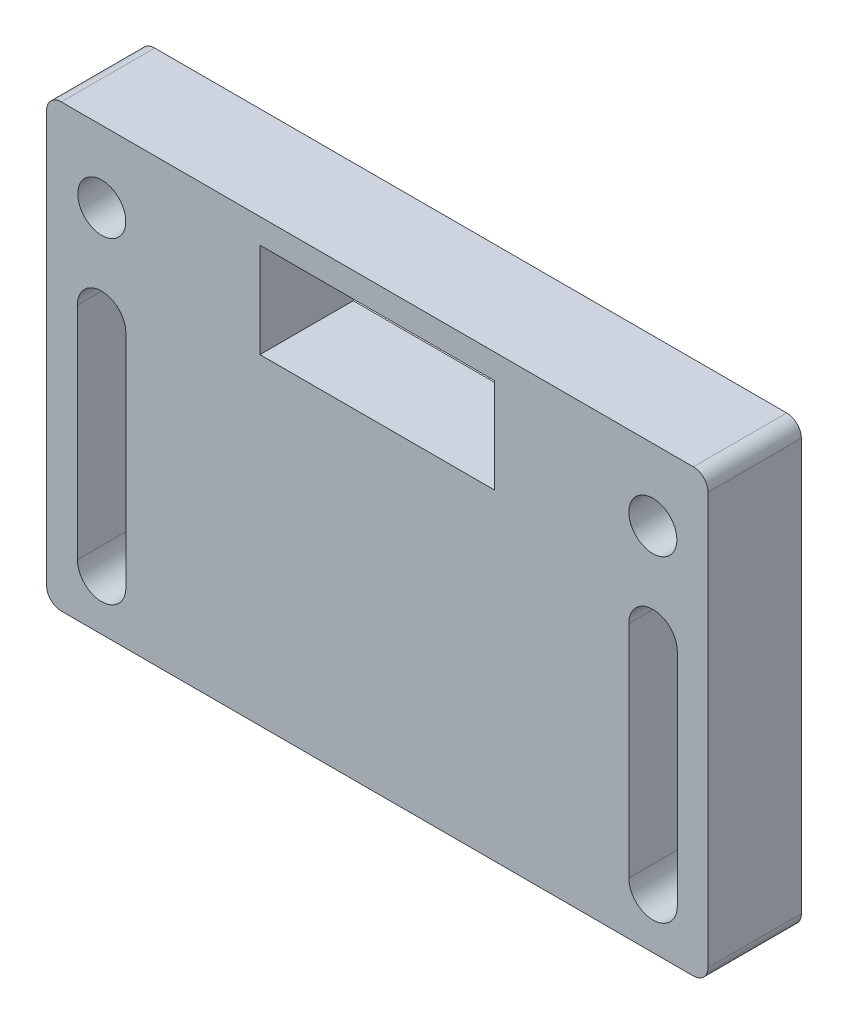
ISO-10303-21;
HEADER;
FILE_DESCRIPTION(('STEP AP214'),'2;1');
FILE_NAME('part.step','',(''),(''),'','','');
FILE_SCHEMA(('AUTOMOTIVE_DESIGN { 1 0 10303 214 1 1 1 1 }'));
ENDSEC;
DATA;
#1=APPLICATION_CONTEXT('core data for automotive mechanical design processes');
#2=APPLICATION_PROTOCOL_DEFINITION('international standard','automotive_design',2000,#1);
#3=PRODUCT_CONTEXT('',#1,'mechanical');
#4=PRODUCT('Part','Part','',(#3));
#5=PRODUCT_RELATED_PRODUCT_CATEGORY('part','',(#4));
#6=PRODUCT_DEFINITION_FORMATION('','',#4);
#7=PRODUCT_DEFINITION_CONTEXT('part definition',#1,'design');
#8=PRODUCT_DEFINITION('design','',#6,#7);
#9=PRODUCT_DEFINITION_SHAPE('','',#8);
#10=(LENGTH_UNIT() NAMED_UNIT(*) SI_UNIT(.MILLI.,.METRE.));
#11=(NAMED_UNIT(*) PLANE_ANGLE_UNIT() SI_UNIT($,.RADIAN.));
#12=(NAMED_UNIT(*) SI_UNIT($,.STERADIAN.) SOLID_ANGLE_UNIT());
#13=UNCERTAINTY_MEASURE_WITH_UNIT(LENGTH_MEASURE(1.E-05),#10,'distance_accuracy_value','');
#14=(GEOMETRIC_REPRESENTATION_CONTEXT(3) GLOBAL_UNCERTAINTY_ASSIGNED_CONTEXT((#13)) GLOBAL_UNIT_ASSIGNED_CONTEXT((#10,
#11,#12)) REPRESENTATION_CONTEXT('',''));
#15=CARTESIAN_POINT('',(0.,0.,0.));
#16=DIRECTION('',(0.,0.,1.));
#17=DIRECTION('',(1.,0.,0.));
#18=AXIS2_PLACEMENT_3D('',#15,#16,#17);
#19=CARTESIAN_POINT('',(0.,0.,0.));
#20=DIRECTION('',(0.,0.,1.));
#21=DIRECTION('',(1.,0.,0.));
#22=AXIS2_PLACEMENT_3D('',#19,#20,#21);
#23=PLANE('',#22);
#24=DIRECTION('',(0.,-1.,0.));
#25=VECTOR('',#24,1.);
#26=CARTESIAN_POINT('',(10.785,-22.8473649807679,0.));
#27=LINE('',#26,#25);
#28=CARTESIAN_POINT('',(10.785,-22.8473649807679,0.));
#29=VERTEX_POINT('',#28);
#30=CARTESIAN_POINT('',(10.785,-52.8473649807679,0.));
#31=VERTEX_POINT('',#30);
#32=EDGE_CURVE('E202',#29,#31,#27,.T.);
#33=ORIENTED_EDGE('',*,*,#32,.F.);
#34=CARTESIAN_POINT('',(7.485,-22.8473649807679,0.));
#35=DIRECTION('',(0.,0.,-1.));
#36=DIRECTION('',(-1.,0.,0.));
#37=AXIS2_PLACEMENT_3D('',#34,#35,#36);
#38=CIRCLE('',#37,3.3);
#39=CARTESIAN_POINT('',(4.185,-22.8473649807679,0.));
#40=VERTEX_POINT('',#39);
#41=EDGE_CURVE('E51',#40,#29,#38,.T.);
#42=ORIENTED_EDGE('',*,*,#41,.F.);
#43=DIRECTION('',(0.,1.,0.));
#44=VECTOR('',#43,1.);
#45=CARTESIAN_POINT('',(4.185,-52.8473649807679,0.));
#46=LINE('',#45,#44);
#47=CARTESIAN_POINT('',(4.185,-52.8473649807679,0.));
#48=VERTEX_POINT('',#47);
#49=EDGE_CURVE('E193',#48,#40,#46,.T.);
#50=ORIENTED_EDGE('',*,*,#49,.F.);
#51=CARTESIAN_POINT('',(7.485,-52.8473649807679,0.));
#52=DIRECTION('',(0.,0.,-1.));
#53=DIRECTION('',(-1.,0.,0.));
#54=AXIS2_PLACEMENT_3D('',#51,#52,#53);
#55=CIRCLE('',#54,3.3);
#56=EDGE_CURVE('E196',#31,#48,#55,.T.);
#57=ORIENTED_EDGE('',*,*,#56,.F.);
#58=EDGE_LOOP('',(#33,#42,#50,#57));
#59=FACE_BOUND('',#58,.T.);
#60=DIRECTION('',(0.,1.,0.));
#61=VECTOR('',#60,1.);
#62=CARTESIAN_POINT('',(79.215,-52.8473649807679,0.));
#63=LINE('',#62,#61);
#64=CARTESIAN_POINT('',(79.215,-52.8473649807679,0.));
#65=VERTEX_POINT('',#64);
#66=CARTESIAN_POINT('',(79.215,-22.8473649807679,0.));
#67=VERTEX_POINT('',#66);
#68=EDGE_CURVE('E228',#65,#67,#63,.T.);
#69=ORIENTED_EDGE('',*,*,#68,.F.);
#70=CARTESIAN_POINT('',(82.515,-52.8473649807679,0.));
#71=DIRECTION('',(0.,0.,-1.));
#72=DIRECTION('',(-1.,0.,0.));
#73=AXIS2_PLACEMENT_3D('',#70,#71,#72);
#74=CIRCLE('',#73,3.3);
#75=CARTESIAN_POINT('',(85.815,-52.8473649807679,0.));
#76=VERTEX_POINT('',#75);
#77=EDGE_CURVE('E59',#76,#65,#74,.T.);
#78=ORIENTED_EDGE('',*,*,#77,.F.);
#79=DIRECTION('',(0.,-1.,0.));
#80=VECTOR('',#79,1.);
#81=CARTESIAN_POINT('',(85.815,-52.8473649807679,0.));
#82=LINE('',#81,#80);
#83=CARTESIAN_POINT('',(85.815,-22.8473649807679,0.));
#84=VERTEX_POINT('',#83);
#85=EDGE_CURVE('E217',#84,#76,#82,.T.);
#86=ORIENTED_EDGE('',*,*,#85,.F.);
#87=CARTESIAN_POINT('',(82.515,-22.8473649807679,0.));
#88=DIRECTION('',(0.,0.,-1.));
#89=DIRECTION('',(-1.,0.,0.));
#90=AXIS2_PLACEMENT_3D('',#87,#88,#89);
#91=CIRCLE('',#90,3.3);
#92=EDGE_CURVE('E231',#67,#84,#91,.T.);
#93=ORIENTED_EDGE('',*,*,#92,.F.);
#94=EDGE_LOOP('',(#69,#78,#86,#93));
#95=FACE_BOUND('',#94,.T.);
#96=CARTESIAN_POINT('',(82.49,-9.71709190426984,0.));
#97=DIRECTION('',(0.,0.,-1.));
#98=DIRECTION('',(-1.,0.,0.));
#99=AXIS2_PLACEMENT_3D('',#96,#97,#98);
#100=CIRCLE('',#99,6.4389);
#101=CARTESIAN_POINT('',(76.0511,-9.71709190426984,0.));
#102=VERTEX_POINT('',#101);
#103=EDGE_CURVE('E209',#102,#102,#100,.T.);
#104=ORIENTED_EDGE('',*,*,#103,.F.);
#105=EDGE_LOOP('',(#104));
#106=FACE_BOUND('',#105,.T.);
#107=DIRECTION('',(1.,0.,0.));
#108=VECTOR('',#107,1.);
#109=CARTESIAN_POINT('',(0.,-60.,0.));
#110=LINE('',#109,#108);
#111=CARTESIAN_POINT('',(2.00000000000001,-60.,0.));
#112=VERTEX_POINT('',#111);
#113=CARTESIAN_POINT('',(88.,-60.,0.));
#114=VERTEX_POINT('',#113);
#115=EDGE_CURVE('E305',#112,#114,#110,.T.);
#116=ORIENTED_EDGE('',*,*,#115,.F.);
#117=CARTESIAN_POINT('',(2.00000000000001,-58.,0.));
#118=DIRECTION('',(0.,0.,1.));
#119=DIRECTION('',(1.,0.,0.));
#120=AXIS2_PLACEMENT_3D('',#117,#118,#119);
#121=CIRCLE('',#120,2.);
#122=CARTESIAN_POINT('',(0.,-58.,0.));
#123=VERTEX_POINT('',#122);
#124=EDGE_CURVE('E323',#112,#123,#121,.F.);
#125=ORIENTED_EDGE('',*,*,#124,.T.);
#126=DIRECTION('',(0.,-1.,0.));
#127=VECTOR('',#126,1.);
#128=CARTESIAN_POINT('',(0.,0.,0.));
#129=LINE('',#128,#127);
#130=CARTESIAN_POINT('',(0.,-2.,0.));
#131=VERTEX_POINT('',#130);
#132=EDGE_CURVE('E288',#131,#123,#129,.T.);
#133=ORIENTED_EDGE('',*,*,#132,.F.);
#134=CARTESIAN_POINT('',(2.,-2.,0.));
#135=DIRECTION('',(0.,0.,1.));
#136=DIRECTION('',(1.,0.,0.));
#137=AXIS2_PLACEMENT_3D('',#134,#135,#136);
#138=CIRCLE('',#137,2.);
#139=CARTESIAN_POINT('',(2.,0.,0.));
#140=VERTEX_POINT('',#139);
#141=EDGE_CURVE('E321',#131,#140,#138,.F.);
#142=ORIENTED_EDGE('',*,*,#141,.T.);
#143=DIRECTION('',(-1.,0.,0.));
#144=VECTOR('',#143,1.);
#145=CARTESIAN_POINT('',(0.,0.,0.));
#146=LINE('',#145,#144);
#147=CARTESIAN_POINT('',(88.,0.,0.));
#148=VERTEX_POINT('',#147);
#149=EDGE_CURVE('E293',#148,#140,#146,.T.);
#150=ORIENTED_EDGE('',*,*,#149,.F.);
#151=CARTESIAN_POINT('',(88.,-2.,0.));
#152=DIRECTION('',(0.,0.,1.));
#153=DIRECTION('',(1.,0.,0.));
#154=AXIS2_PLACEMENT_3D('',#151,#152,#153);
#155=CIRCLE('',#154,2.);
#156=CARTESIAN_POINT('',(90.,-2.,0.));
#157=VERTEX_POINT('',#156);
#158=EDGE_CURVE('E319',#148,#157,#155,.F.);
#159=ORIENTED_EDGE('',*,*,#158,.T.);
#160=DIRECTION('',(0.,1.,0.));
#161=VECTOR('',#160,1.);
#162=CARTESIAN_POINT('',(90.,0.,0.));
#163=LINE('',#162,#161);
#164=CARTESIAN_POINT('',(90.,-58.,0.));
#165=VERTEX_POINT('',#164);
#166=EDGE_CURVE('E308',#165,#157,#163,.T.);
#167=ORIENTED_EDGE('',*,*,#166,.F.);
#168=CARTESIAN_POINT('',(88.,-58.,0.));
#169=DIRECTION('',(0.,0.,1.));
#170=DIRECTION('',(1.,0.,0.));
#171=AXIS2_PLACEMENT_3D('',#168,#169,#170);
#172=CIRCLE('',#171,2.);
#173=EDGE_CURVE('E317',#165,#114,#172,.F.);
#174=ORIENTED_EDGE('',*,*,#173,.T.);
#175=EDGE_LOOP('',(#116,#125,#133,#142,#150,#159,#167,#174));
#176=FACE_BOUND('',#175,.T.);
#177=DIRECTION('',(0.,-1.,0.));
#178=VECTOR('',#177,1.);
#179=CARTESIAN_POINT('',(29.025,-3.36709190426983,0.));
#180=LINE('',#179,#178);
#181=CARTESIAN_POINT('',(29.025,-3.36709190426983,0.));
#182=VERTEX_POINT('',#181);
#183=CARTESIAN_POINT('',(29.025,-16.2670919042698,0.));
#184=VERTEX_POINT('',#183);
#185=EDGE_CURVE('E259',#182,#184,#180,.T.);
#186=ORIENTED_EDGE('',*,*,#185,.T.);
#187=DIRECTION('',(1.,0.,0.));
#188=VECTOR('',#187,1.);
#189=CARTESIAN_POINT('',(29.025,-16.2670919042698,0.));
#190=LINE('',#189,#188);
#191=CARTESIAN_POINT('',(60.975,-16.2670919042698,0.));
#192=VERTEX_POINT('',#191);
#193=EDGE_CURVE('E273',#184,#192,#190,.T.);
#194=ORIENTED_EDGE('',*,*,#193,.T.);
#195=DIRECTION('',(0.,1.,0.));
#196=VECTOR('',#195,1.);
#197=CARTESIAN_POINT('',(60.975,-16.2670919042698,0.));
#198=LINE('',#197,#196);
#199=CARTESIAN_POINT('',(60.975,-3.36709190426982,0.));
#200=VERTEX_POINT('',#199);
#201=EDGE_CURVE('E276',#192,#200,#198,.T.);
#202=ORIENTED_EDGE('',*,*,#201,.T.);
#203=DIRECTION('',(-1.,0.,0.));
#204=VECTOR('',#203,1.);
#205=CARTESIAN_POINT('',(60.975,-3.36709190426982,0.));
#206=LINE('',#205,#204);
#207=EDGE_CURVE('E263',#200,#182,#206,.T.);
#208=ORIENTED_EDGE('',*,*,#207,.T.);
#209=EDGE_LOOP('',(#186,#194,#202,#208));
#210=FACE_BOUND('',#209,.T.);
#211=CARTESIAN_POINT('',(7.51,-9.71709190426983,0.));
#212=DIRECTION('',(0.,0.,-1.));
#213=DIRECTION('',(-1.,0.,0.));
#214=AXIS2_PLACEMENT_3D('',#211,#212,#213);
#215=CIRCLE('',#214,6.4389);
#216=CARTESIAN_POINT('',(1.0711,-9.71709190426983,0.));
#217=VERTEX_POINT('',#216);
#218=EDGE_CURVE('E250',#217,#217,#215,.T.);
#219=ORIENTED_EDGE('',*,*,#218,.F.);
#220=EDGE_LOOP('',(#219));
#221=FACE_BOUND('',#220,.T.);
#222=ADVANCED_FACE('F36',(#59,#95,#106,#176,#210,#221),#23,.F.);
#223=CARTESIAN_POINT('',(0.,0.,12.7));
#224=DIRECTION('',(0.,0.,1.));
#225=DIRECTION('',(1.,0.,0.));
#226=AXIS2_PLACEMENT_3D('',#223,#224,#225);
#227=PLANE('',#226);
#228=CARTESIAN_POINT('',(7.485,-22.8473649807679,12.7));
#229=DIRECTION('',(0.,0.,-1.));
#230=DIRECTION('',(-1.,0.,0.));
#231=AXIS2_PLACEMENT_3D('',#228,#229,#230);
#232=CIRCLE('',#231,3.3);
#233=CARTESIAN_POINT('',(4.185,-22.8473649807679,12.7));
#234=VERTEX_POINT('',#233);
#235=CARTESIAN_POINT('',(10.785,-22.8473649807679,12.7));
#236=VERTEX_POINT('',#235);
#237=EDGE_CURVE('E174',#234,#236,#232,.T.);
#238=ORIENTED_EDGE('',*,*,#237,.T.);
#239=DIRECTION('',(0.,-1.,0.));
#240=VECTOR('',#239,1.);
#241=CARTESIAN_POINT('',(10.785,-22.8473649807679,12.7));
#242=LINE('',#241,#240);
#243=CARTESIAN_POINT('',(10.785,-52.8473649807679,12.7));
#244=VERTEX_POINT('',#243);
#245=EDGE_CURVE('E184',#236,#244,#242,.T.);
#246=ORIENTED_EDGE('',*,*,#245,.T.);
#247=CARTESIAN_POINT('',(7.485,-52.8473649807679,12.7));
#248=DIRECTION('',(0.,0.,-1.));
#249=DIRECTION('',(-1.,0.,0.));
#250=AXIS2_PLACEMENT_3D('',#247,#248,#249);
#251=CIRCLE('',#250,3.3);
#252=CARTESIAN_POINT('',(4.185,-52.8473649807679,12.7));
#253=VERTEX_POINT('',#252);
#254=EDGE_CURVE('E188',#244,#253,#251,.T.);
#255=ORIENTED_EDGE('',*,*,#254,.T.);
#256=DIRECTION('',(0.,1.,0.));
#257=VECTOR('',#256,1.);
#258=CARTESIAN_POINT('',(4.185,-52.8473649807679,12.7));
#259=LINE('',#258,#257);
#260=EDGE_CURVE('E180',#253,#234,#259,.T.);
#261=ORIENTED_EDGE('',*,*,#260,.T.);
#262=EDGE_LOOP('',(#238,#246,#255,#261));
#263=FACE_BOUND('',#262,.T.);
#264=CARTESIAN_POINT('',(82.515,-52.8473649807679,12.7));
#265=DIRECTION('',(0.,0.,-1.));
#266=DIRECTION('',(-1.,0.,0.));
#267=AXIS2_PLACEMENT_3D('',#264,#265,#266);
#268=CIRCLE('',#267,3.3);
#269=CARTESIAN_POINT('',(85.815,-52.8473649807679,12.7));
#270=VERTEX_POINT('',#269);
#271=CARTESIAN_POINT('',(79.215,-52.8473649807679,12.7));
#272=VERTEX_POINT('',#271);
#273=EDGE_CURVE('E213',#270,#272,#268,.T.);
#274=ORIENTED_EDGE('',*,*,#273,.T.);
#275=DIRECTION('',(0.,1.,0.));
#276=VECTOR('',#275,1.);
#277=CARTESIAN_POINT('',(79.215,-52.8473649807679,12.7));
#278=LINE('',#277,#276);
#279=CARTESIAN_POINT('',(79.215,-22.8473649807679,12.7));
#280=VERTEX_POINT('',#279);
#281=EDGE_CURVE('E216',#272,#280,#278,.T.);
#282=ORIENTED_EDGE('',*,*,#281,.T.);
#283=CARTESIAN_POINT('',(82.515,-22.8473649807679,12.7));
#284=DIRECTION('',(0.,0.,-1.));
#285=DIRECTION('',(-1.,0.,0.));
#286=AXIS2_PLACEMENT_3D('',#283,#284,#285);
#287=CIRCLE('',#286,3.3);
#288=CARTESIAN_POINT('',(85.815,-22.8473649807679,12.7));
#289=VERTEX_POINT('',#288);
#290=EDGE_CURVE('E220',#280,#289,#287,.T.);
#291=ORIENTED_EDGE('',*,*,#290,.T.);
#292=DIRECTION('',(0.,-1.,0.));
#293=VECTOR('',#292,1.);
#294=CARTESIAN_POINT('',(85.815,-52.8473649807679,12.7));
#295=LINE('',#294,#293);
#296=EDGE_CURVE('E223',#289,#270,#295,.T.);
#297=ORIENTED_EDGE('',*,*,#296,.T.);
#298=EDGE_LOOP('',(#274,#282,#291,#297));
#299=FACE_BOUND('',#298,.T.);
#300=CARTESIAN_POINT('',(82.49,-9.71709190426984,12.7));
#301=DIRECTION('',(0.,0.,-1.));
#302=DIRECTION('',(-1.,0.,0.));
#303=AXIS2_PLACEMENT_3D('',#300,#301,#302);
#304=CIRCLE('',#303,3.26389999999999);
#305=CARTESIAN_POINT('',(79.2261,-9.71709190426984,12.7));
#306=VERTEX_POINT('',#305);
#307=EDGE_CURVE('E247',#306,#306,#304,.T.);
#308=ORIENTED_EDGE('',*,*,#307,.T.);
#309=EDGE_LOOP('',(#308));
#310=FACE_BOUND('',#309,.T.);
#311=CARTESIAN_POINT('',(7.51,-9.71709190426983,12.7));
#312=DIRECTION('',(0.,0.,-1.));
#313=DIRECTION('',(-1.,0.,0.));
#314=AXIS2_PLACEMENT_3D('',#311,#312,#313);
#315=CIRCLE('',#314,3.26389999999999);
#316=CARTESIAN_POINT('',(4.24610000000001,-9.71709190426983,12.7));
#317=VERTEX_POINT('',#316);
#318=EDGE_CURVE('E256',#317,#317,#315,.T.);
#319=ORIENTED_EDGE('',*,*,#318,.T.);
#320=EDGE_LOOP('',(#319));
#321=FACE_BOUND('',#320,.T.);
#322=DIRECTION('',(0.,-1.,0.));
#323=VECTOR('',#322,1.);
#324=CARTESIAN_POINT('',(0.,0.,12.7));
#325=LINE('',#324,#323);
#326=CARTESIAN_POINT('',(0.,-2.,12.7));
#327=VERTEX_POINT('',#326);
#328=CARTESIAN_POINT('',(0.,-58.,12.7));
#329=VERTEX_POINT('',#328);
#330=EDGE_CURVE('E289',#327,#329,#325,.T.);
#331=ORIENTED_EDGE('',*,*,#330,.T.);
#332=CARTESIAN_POINT('',(2.00000000000001,-58.,12.7));
#333=DIRECTION('',(0.,0.,1.));
#334=DIRECTION('',(1.,0.,0.));
#335=AXIS2_PLACEMENT_3D('',#332,#333,#334);
#336=CIRCLE('',#335,2.);
#337=CARTESIAN_POINT('',(2.00000000000001,-60.,12.7));
#338=VERTEX_POINT('',#337);
#339=EDGE_CURVE('E336',#329,#338,#336,.T.);
#340=ORIENTED_EDGE('',*,*,#339,.T.);
#341=DIRECTION('',(1.,0.,0.));
#342=VECTOR('',#341,1.);
#343=CARTESIAN_POINT('',(0.,-60.,12.7));
#344=LINE('',#343,#342);
#345=CARTESIAN_POINT('',(88.,-60.,12.7));
#346=VERTEX_POINT('',#345);
#347=EDGE_CURVE('E292',#338,#346,#344,.T.);
#348=ORIENTED_EDGE('',*,*,#347,.T.);
#349=CARTESIAN_POINT('',(88.,-58.,12.7));
#350=DIRECTION('',(0.,0.,1.));
#351=DIRECTION('',(1.,0.,0.));
#352=AXIS2_PLACEMENT_3D('',#349,#350,#351);
#353=CIRCLE('',#352,2.);
#354=CARTESIAN_POINT('',(90.,-58.,12.7));
#355=VERTEX_POINT('',#354);
#356=EDGE_CURVE('E330',#346,#355,#353,.T.);
#357=ORIENTED_EDGE('',*,*,#356,.T.);
#358=DIRECTION('',(0.,1.,0.));
#359=VECTOR('',#358,1.);
#360=CARTESIAN_POINT('',(90.,0.,12.7));
#361=LINE('',#360,#359);
#362=CARTESIAN_POINT('',(90.,-2.,12.7));
#363=VERTEX_POINT('',#362);
#364=EDGE_CURVE('E296',#355,#363,#361,.T.);
#365=ORIENTED_EDGE('',*,*,#364,.T.);
#366=CARTESIAN_POINT('',(88.,-2.,12.7));
#367=DIRECTION('',(0.,0.,1.));
#368=DIRECTION('',(1.,0.,0.));
#369=AXIS2_PLACEMENT_3D('',#366,#367,#368);
#370=CIRCLE('',#369,2.);
#371=CARTESIAN_POINT('',(88.,0.,12.7));
#372=VERTEX_POINT('',#371);
#373=EDGE_CURVE('E332',#363,#372,#370,.T.);
#374=ORIENTED_EDGE('',*,*,#373,.T.);
#375=DIRECTION('',(-1.,0.,0.));
#376=VECTOR('',#375,1.);
#377=CARTESIAN_POINT('',(0.,0.,12.7));
#378=LINE('',#377,#376);
#379=CARTESIAN_POINT('',(2.,0.,12.7));
#380=VERTEX_POINT('',#379);
#381=EDGE_CURVE('E299',#372,#380,#378,.T.);
#382=ORIENTED_EDGE('',*,*,#381,.T.);
#383=CARTESIAN_POINT('',(2.,-2.,12.7));
#384=DIRECTION('',(0.,0.,1.));
#385=DIRECTION('',(1.,0.,0.));
#386=AXIS2_PLACEMENT_3D('',#383,#384,#385);
#387=CIRCLE('',#386,2.);
#388=EDGE_CURVE('E334',#380,#327,#387,.T.);
#389=ORIENTED_EDGE('',*,*,#388,.T.);
#390=EDGE_LOOP('',(#331,#340,#348,#357,#365,#374,#382,#389));
#391=FACE_BOUND('',#390,.T.);
#392=DIRECTION('',(1.,0.,0.));
#393=VECTOR('',#392,1.);
#394=CARTESIAN_POINT('',(29.025,-16.2670919042698,12.7));
#395=LINE('',#394,#393);
#396=CARTESIAN_POINT('',(29.025,-16.2670919042698,12.7));
#397=VERTEX_POINT('',#396);
#398=CARTESIAN_POINT('',(60.975,-16.2670919042698,12.7));
#399=VERTEX_POINT('',#398);
#400=EDGE_CURVE('E265',#397,#399,#395,.T.);
#401=ORIENTED_EDGE('',*,*,#400,.F.);
#402=DIRECTION('',(0.,-1.,0.));
#403=VECTOR('',#402,1.);
#404=CARTESIAN_POINT('',(29.025,-3.36709190426983,12.7));
#405=LINE('',#404,#403);
#406=CARTESIAN_POINT('',(29.025,-3.36709190426983,12.7));
#407=VERTEX_POINT('',#406);
#408=EDGE_CURVE('E262',#407,#397,#405,.T.);
#409=ORIENTED_EDGE('',*,*,#408,.F.);
#410=DIRECTION('',(-1.,0.,0.));
#411=VECTOR('',#410,1.);
#412=CARTESIAN_POINT('',(45.,-3.36709190426982,12.7));
#413=LINE('',#412,#411);
#414=CARTESIAN_POINT('',(60.975,-3.36709190426982,12.7));
#415=VERTEX_POINT('',#414);
#416=EDGE_CURVE('E260',#415,#407,#413,.T.);
#417=ORIENTED_EDGE('',*,*,#416,.F.);
#418=DIRECTION('',(0.,1.,0.));
#419=VECTOR('',#418,1.);
#420=CARTESIAN_POINT('',(60.975,-16.2670919042698,12.7));
#421=LINE('',#420,#419);
#422=EDGE_CURVE('E267',#399,#415,#421,.T.);
#423=ORIENTED_EDGE('',*,*,#422,.F.);
#424=EDGE_LOOP('',(#401,#409,#417,#423));
#425=FACE_BOUND('',#424,.T.);
#426=ADVANCED_FACE('F190',(#263,#299,#310,#321,#391,#425),#227,.T.);
#427=CARTESIAN_POINT('',(0.,0.,12.7));
#428=DIRECTION('',(1.,0.,0.));
#429=DIRECTION('',(0.,1.,0.));
#430=AXIS2_PLACEMENT_3D('',#427,#428,#429);
#431=PLANE('',#430);
#432=ORIENTED_EDGE('',*,*,#132,.T.);
#433=DIRECTION('',(0.,0.,-1.));
#434=VECTOR('',#433,1.);
#435=CARTESIAN_POINT('',(0.,-58.,12.7));
#436=LINE('',#435,#434);
#437=EDGE_CURVE('E328',#123,#329,#436,.F.);
#438=ORIENTED_EDGE('',*,*,#437,.T.);
#439=ORIENTED_EDGE('',*,*,#330,.F.);
#440=DIRECTION('',(0.,0.,-1.));
#441=VECTOR('',#440,1.);
#442=CARTESIAN_POINT('',(0.,-2.,12.7));
#443=LINE('',#442,#441);
#444=EDGE_CURVE('E325',#327,#131,#443,.T.);
#445=ORIENTED_EDGE('',*,*,#444,.T.);
#446=EDGE_LOOP('',(#432,#438,#439,#445));
#447=FACE_BOUND('',#446,.T.);
#448=ADVANCED_FACE('F372',(#447),#431,.F.);
#449=CARTESIAN_POINT('',(0.,-60.,12.7));
#450=DIRECTION('',(0.,1.,0.));
#451=DIRECTION('',(-1.,0.,0.));
#452=AXIS2_PLACEMENT_3D('',#449,#450,#451);
#453=PLANE('',#452);
#454=ORIENTED_EDGE('',*,*,#347,.F.);
#455=DIRECTION('',(0.,0.,-1.));
#456=VECTOR('',#455,1.);
#457=CARTESIAN_POINT('',(2.00000000000001,-60.,12.7));
#458=LINE('',#457,#456);
#459=EDGE_CURVE('E314',#338,#112,#458,.T.);
#460=ORIENTED_EDGE('',*,*,#459,.T.);
#461=ORIENTED_EDGE('',*,*,#115,.T.);
#462=DIRECTION('',(0.,0.,-1.));
#463=VECTOR('',#462,1.);
#464=CARTESIAN_POINT('',(88.,-60.,12.7));
#465=LINE('',#464,#463);
#466=EDGE_CURVE('E302',#114,#346,#465,.F.);
#467=ORIENTED_EDGE('',*,*,#466,.T.);
#468=EDGE_LOOP('',(#454,#460,#461,#467));
#469=FACE_BOUND('',#468,.T.);
#470=ADVANCED_FACE('F380',(#469),#453,.F.);
#471=CARTESIAN_POINT('',(90.,0.,12.7));
#472=DIRECTION('',(-1.,0.,0.));
#473=DIRECTION('',(0.,-1.,0.));
#474=AXIS2_PLACEMENT_3D('',#471,#472,#473);
#475=PLANE('',#474);
#476=ORIENTED_EDGE('',*,*,#166,.T.);
#477=DIRECTION('',(0.,0.,-1.));
#478=VECTOR('',#477,1.);
#479=CARTESIAN_POINT('',(90.,-2.,12.7));
#480=LINE('',#479,#478);
#481=EDGE_CURVE('E11',#157,#363,#480,.F.);
#482=ORIENTED_EDGE('',*,*,#481,.T.);
#483=ORIENTED_EDGE('',*,*,#364,.F.);
#484=DIRECTION('',(0.,0.,-1.));
#485=VECTOR('',#484,1.);
#486=CARTESIAN_POINT('',(90.,-58.,12.7));
#487=LINE('',#486,#485);
#488=EDGE_CURVE('E44',#355,#165,#487,.T.);
#489=ORIENTED_EDGE('',*,*,#488,.T.);
#490=EDGE_LOOP('',(#476,#482,#483,#489));
#491=FACE_BOUND('',#490,.T.);
#492=ADVANCED_FACE('F347',(#491),#475,.F.);
#493=CARTESIAN_POINT('',(0.,0.,12.7));
#494=DIRECTION('',(0.,-1.,0.));
#495=DIRECTION('',(0.,0.,-1.));
#496=AXIS2_PLACEMENT_3D('',#493,#494,#495);
#497=PLANE('',#496);
#498=ORIENTED_EDGE('',*,*,#149,.T.);
#499=DIRECTION('',(0.,0.,-1.));
#500=VECTOR('',#499,1.);
#501=CARTESIAN_POINT('',(2.,0.,12.7));
#502=LINE('',#501,#500);
#503=EDGE_CURVE('E341',#140,#380,#502,.F.);
#504=ORIENTED_EDGE('',*,*,#503,.T.);
#505=ORIENTED_EDGE('',*,*,#381,.F.);
#506=DIRECTION('',(0.,0.,-1.));
#507=VECTOR('',#506,1.);
#508=CARTESIAN_POINT('',(88.,0.,12.7));
#509=LINE('',#508,#507);
#510=EDGE_CURVE('E338',#372,#148,#509,.T.);
#511=ORIENTED_EDGE('',*,*,#510,.T.);
#512=EDGE_LOOP('',(#498,#504,#505,#511));
#513=FACE_BOUND('',#512,.T.);
#514=ADVANCED_FACE('F361',(#513),#497,.F.);
#515=CARTESIAN_POINT('',(29.025,-3.36709190426983,12.7));
#516=DIRECTION('',(1.,0.,0.));
#517=DIRECTION('',(0.,0.,-1.));
#518=AXIS2_PLACEMENT_3D('',#515,#516,#517);
#519=PLANE('',#518);
#520=ORIENTED_EDGE('',*,*,#185,.F.);
#521=DIRECTION('',(0.,0.,-1.));
#522=VECTOR('',#521,1.);
#523=CARTESIAN_POINT('',(29.025,-3.36709190426983,12.7));
#524=LINE('',#523,#522);
#525=EDGE_CURVE('E286',#407,#182,#524,.T.);
#526=ORIENTED_EDGE('',*,*,#525,.F.);
#527=ORIENTED_EDGE('',*,*,#408,.T.);
#528=DIRECTION('',(0.,0.,-1.));
#529=VECTOR('',#528,1.);
#530=CARTESIAN_POINT('',(29.025,-16.2670919042698,12.7));
#531=LINE('',#530,#529);
#532=EDGE_CURVE('E284',#397,#184,#531,.T.);
#533=ORIENTED_EDGE('',*,*,#532,.T.);
#534=EDGE_LOOP('',(#520,#526,#527,#533));
#535=FACE_BOUND('',#534,.T.);
#536=ADVANCED_FACE('F402',(#535),#519,.T.);
#537=CARTESIAN_POINT('',(29.025,-16.2670919042698,12.7));
#538=DIRECTION('',(0.,1.,0.));
#539=DIRECTION('',(0.,0.,1.));
#540=AXIS2_PLACEMENT_3D('',#537,#538,#539);
#541=PLANE('',#540);
#542=ORIENTED_EDGE('',*,*,#193,.F.);
#543=ORIENTED_EDGE('',*,*,#532,.F.);
#544=ORIENTED_EDGE('',*,*,#400,.T.);
#545=DIRECTION('',(0.,0.,-1.));
#546=VECTOR('',#545,1.);
#547=CARTESIAN_POINT('',(60.975,-16.2670919042698,12.7));
#548=LINE('',#547,#546);
#549=EDGE_CURVE('E282',#399,#192,#548,.T.);
#550=ORIENTED_EDGE('',*,*,#549,.T.);
#551=EDGE_LOOP('',(#542,#543,#544,#550));
#552=FACE_BOUND('',#551,.T.);
#553=ADVANCED_FACE('F536',(#552),#541,.T.);
#554=CARTESIAN_POINT('',(60.975,-16.2670919042698,12.7));
#555=DIRECTION('',(-1.,0.,0.));
#556=DIRECTION('',(0.,0.,1.));
#557=AXIS2_PLACEMENT_3D('',#554,#555,#556);
#558=PLANE('',#557);
#559=ORIENTED_EDGE('',*,*,#201,.F.);
#560=ORIENTED_EDGE('',*,*,#549,.F.);
#561=ORIENTED_EDGE('',*,*,#422,.T.);
#562=DIRECTION('',(0.,0.,-1.));
#563=VECTOR('',#562,1.);
#564=CARTESIAN_POINT('',(60.975,-3.36709190426982,12.7));
#565=LINE('',#564,#563);
#566=EDGE_CURVE('E270',#415,#200,#565,.T.);
#567=ORIENTED_EDGE('',*,*,#566,.T.);
#568=EDGE_LOOP('',(#559,#560,#561,#567));
#569=FACE_BOUND('',#568,.T.);
#570=ADVANCED_FACE('F532',(#569),#558,.T.);
#571=CARTESIAN_POINT('',(60.975,-3.36709190426982,12.7));
#572=DIRECTION('',(0.,-1.,0.));
#573=DIRECTION('',(1.,0.,0.));
#574=AXIS2_PLACEMENT_3D('',#571,#572,#573);
#575=PLANE('',#574);
#576=ORIENTED_EDGE('',*,*,#207,.F.);
#577=ORIENTED_EDGE('',*,*,#566,.F.);
#578=ORIENTED_EDGE('',*,*,#416,.T.);
#579=ORIENTED_EDGE('',*,*,#525,.T.);
#580=EDGE_LOOP('',(#576,#577,#578,#579));
#581=FACE_BOUND('',#580,.T.);
#582=ADVANCED_FACE('F528',(#581),#575,.T.);
#583=CARTESIAN_POINT('',(7.51,-9.71709190426983,0.));
#584=DIRECTION('',(0.,0.,-1.));
#585=DIRECTION('',(-1.,0.,0.));
#586=AXIS2_PLACEMENT_3D('',#583,#584,#585);
#587=CYLINDRICAL_SURFACE('',#586,3.26389999999999);
#588=ORIENTED_EDGE('',*,*,#318,.F.);
#589=EDGE_LOOP('',(#588));
#590=FACE_BOUND('',#589,.T.);
#591=CARTESIAN_POINT('',(7.51,-9.71709190426983,3.65241969292671));
#592=DIRECTION('',(0.,0.,-1.));
#593=DIRECTION('',(-1.,0.,0.));
#594=AXIS2_PLACEMENT_3D('',#591,#592,#593);
#595=CIRCLE('',#594,3.26389999999999);
#596=CARTESIAN_POINT('',(4.24610000000001,-9.71709190426983,3.65241969292671));
#597=VERTEX_POINT('',#596);
#598=EDGE_CURVE('E253',#597,#597,#595,.T.);
#599=ORIENTED_EDGE('',*,*,#598,.T.);
#600=EDGE_LOOP('',(#599));
#601=FACE_BOUND('',#600,.T.);
#602=ADVANCED_FACE('F524',(#590,#601),#587,.F.);
#603=CARTESIAN_POINT('',(7.51,-9.71709190426983,0.));
#604=DIRECTION('',(0.,0.,-1.));
#605=DIRECTION('',(-1.,0.,0.));
#606=AXIS2_PLACEMENT_3D('',#603,#604,#605);
#607=CONICAL_SURFACE('',#606,6.4389,0.715584993317677);
#608=ORIENTED_EDGE('',*,*,#598,.F.);
#609=EDGE_LOOP('',(#608));
#610=FACE_BOUND('',#609,.T.);
#611=ORIENTED_EDGE('',*,*,#218,.T.);
#612=EDGE_LOOP('',(#611));
#613=FACE_BOUND('',#612,.T.);
#614=ADVANCED_FACE('F520',(#610,#613),#607,.F.);
#615=CARTESIAN_POINT('',(82.49,-9.71709190426984,0.));
#616=DIRECTION('',(0.,0.,-1.));
#617=DIRECTION('',(-1.,0.,0.));
#618=AXIS2_PLACEMENT_3D('',#615,#616,#617);
#619=CYLINDRICAL_SURFACE('',#618,3.26389999999999);
#620=ORIENTED_EDGE('',*,*,#307,.F.);
#621=EDGE_LOOP('',(#620));
#622=FACE_BOUND('',#621,.T.);
#623=CARTESIAN_POINT('',(82.49,-9.71709190426984,3.65241969292671));
#624=DIRECTION('',(0.,0.,-1.));
#625=DIRECTION('',(-1.,0.,0.));
#626=AXIS2_PLACEMENT_3D('',#623,#624,#625);
#627=CIRCLE('',#626,3.26389999999999);
#628=CARTESIAN_POINT('',(79.2261,-9.71709190426984,3.65241969292671));
#629=VERTEX_POINT('',#628);
#630=EDGE_CURVE('E244',#629,#629,#627,.T.);
#631=ORIENTED_EDGE('',*,*,#630,.T.);
#632=EDGE_LOOP('',(#631));
#633=FACE_BOUND('',#632,.T.);
#634=ADVANCED_FACE('F516',(#622,#633),#619,.F.);
#635=CARTESIAN_POINT('',(82.49,-9.71709190426984,0.));
#636=DIRECTION('',(0.,0.,-1.));
#637=DIRECTION('',(-1.,0.,0.));
#638=AXIS2_PLACEMENT_3D('',#635,#636,#637);
#639=CONICAL_SURFACE('',#638,6.4389,0.715584993317677);
#640=ORIENTED_EDGE('',*,*,#630,.F.);
#641=EDGE_LOOP('',(#640));
#642=FACE_BOUND('',#641,.T.);
#643=ORIENTED_EDGE('',*,*,#103,.T.);
#644=EDGE_LOOP('',(#643));
#645=FACE_BOUND('',#644,.T.);
#646=ADVANCED_FACE('F411',(#642,#645),#639,.F.);
#647=CARTESIAN_POINT('',(2.00000000000001,-58.,12.7));
#648=DIRECTION('',(0.,0.,-1.));
#649=DIRECTION('',(-1.,0.,0.));
#650=AXIS2_PLACEMENT_3D('',#647,#648,#649);
#651=CYLINDRICAL_SURFACE('',#650,2.);
#652=ORIENTED_EDGE('',*,*,#339,.F.);
#653=ORIENTED_EDGE('',*,*,#437,.F.);
#654=ORIENTED_EDGE('',*,*,#124,.F.);
#655=ORIENTED_EDGE('',*,*,#459,.F.);
#656=EDGE_LOOP('',(#652,#653,#654,#655));
#657=FACE_BOUND('',#656,.T.);
#658=ADVANCED_FACE('F377',(#657),#651,.T.);
#659=CARTESIAN_POINT('',(2.,-2.,12.7));
#660=DIRECTION('',(0.,0.,-1.));
#661=DIRECTION('',(-1.,0.,0.));
#662=AXIS2_PLACEMENT_3D('',#659,#660,#661);
#663=CYLINDRICAL_SURFACE('',#662,2.);
#664=ORIENTED_EDGE('',*,*,#388,.F.);
#665=ORIENTED_EDGE('',*,*,#503,.F.);
#666=ORIENTED_EDGE('',*,*,#141,.F.);
#667=ORIENTED_EDGE('',*,*,#444,.F.);
#668=EDGE_LOOP('',(#664,#665,#666,#667));
#669=FACE_BOUND('',#668,.T.);
#670=ADVANCED_FACE('F369',(#669),#663,.T.);
#671=CARTESIAN_POINT('',(88.,-2.,12.7));
#672=DIRECTION('',(0.,0.,-1.));
#673=DIRECTION('',(-1.,0.,0.));
#674=AXIS2_PLACEMENT_3D('',#671,#672,#673);
#675=CYLINDRICAL_SURFACE('',#674,2.);
#676=ORIENTED_EDGE('',*,*,#373,.F.);
#677=ORIENTED_EDGE('',*,*,#481,.F.);
#678=ORIENTED_EDGE('',*,*,#158,.F.);
#679=ORIENTED_EDGE('',*,*,#510,.F.);
#680=EDGE_LOOP('',(#676,#677,#678,#679));
#681=FACE_BOUND('',#680,.T.);
#682=ADVANCED_FACE('F358',(#681),#675,.T.);
#683=CARTESIAN_POINT('',(88.,-58.,12.7));
#684=DIRECTION('',(0.,0.,-1.));
#685=DIRECTION('',(-1.,0.,0.));
#686=AXIS2_PLACEMENT_3D('',#683,#684,#685);
#687=CYLINDRICAL_SURFACE('',#686,2.);
#688=ORIENTED_EDGE('',*,*,#356,.F.);
#689=ORIENTED_EDGE('',*,*,#466,.F.);
#690=ORIENTED_EDGE('',*,*,#173,.F.);
#691=ORIENTED_EDGE('',*,*,#488,.F.);
#692=EDGE_LOOP('',(#688,#689,#690,#691));
#693=FACE_BOUND('',#692,.T.);
#694=ADVANCED_FACE('F38',(#693),#687,.T.);
#695=CARTESIAN_POINT('',(82.515,-52.8473649807679,12.7));
#696=DIRECTION('',(0.,0.,-1.));
#697=DIRECTION('',(-1.,0.,0.));
#698=AXIS2_PLACEMENT_3D('',#695,#696,#697);
#699=CYLINDRICAL_SURFACE('',#698,3.3);
#700=ORIENTED_EDGE('',*,*,#77,.T.);
#701=DIRECTION('',(0.,0.,-1.));
#702=VECTOR('',#701,1.);
#703=CARTESIAN_POINT('',(79.215,-52.8473649807679,12.7));
#704=LINE('',#703,#702);
#705=EDGE_CURVE('E226',#272,#65,#704,.T.);
#706=ORIENTED_EDGE('',*,*,#705,.F.);
#707=ORIENTED_EDGE('',*,*,#273,.F.);
#708=DIRECTION('',(0.,0.,-1.));
#709=VECTOR('',#708,1.);
#710=CARTESIAN_POINT('',(85.815,-52.8473649807679,12.7));
#711=LINE('',#710,#709);
#712=EDGE_CURVE('E203',#270,#76,#711,.T.);
#713=ORIENTED_EDGE('',*,*,#712,.T.);
#714=EDGE_LOOP('',(#700,#706,#707,#713));
#715=FACE_BOUND('',#714,.T.);
#716=ADVANCED_FACE('F383',(#715),#699,.F.);
#717=CARTESIAN_POINT('',(85.815,-52.8473649807679,12.7));
#718=DIRECTION('',(1.,0.,0.));
#719=DIRECTION('',(0.,0.,-1.));
#720=AXIS2_PLACEMENT_3D('',#717,#718,#719);
#721=PLANE('',#720);
#722=ORIENTED_EDGE('',*,*,#85,.T.);
#723=ORIENTED_EDGE('',*,*,#712,.F.);
#724=ORIENTED_EDGE('',*,*,#296,.F.);
#725=DIRECTION('',(0.,0.,-1.));
#726=VECTOR('',#725,1.);
#727=CARTESIAN_POINT('',(85.815,-22.8473649807679,12.7));
#728=LINE('',#727,#726);
#729=EDGE_CURVE('E237',#289,#84,#728,.T.);
#730=ORIENTED_EDGE('',*,*,#729,.T.);
#731=EDGE_LOOP('',(#722,#723,#724,#730));
#732=FACE_BOUND('',#731,.T.);
#733=ADVANCED_FACE('F388',(#732),#721,.F.);
#734=CARTESIAN_POINT('',(82.515,-22.8473649807679,12.7));
#735=DIRECTION('',(0.,0.,-1.));
#736=DIRECTION('',(-1.,0.,0.));
#737=AXIS2_PLACEMENT_3D('',#734,#735,#736);
#738=CYLINDRICAL_SURFACE('',#737,3.3);
#739=ORIENTED_EDGE('',*,*,#92,.T.);
#740=ORIENTED_EDGE('',*,*,#729,.F.);
#741=ORIENTED_EDGE('',*,*,#290,.F.);
#742=DIRECTION('',(0.,0.,-1.));
#743=VECTOR('',#742,1.);
#744=CARTESIAN_POINT('',(79.215,-22.8473649807679,12.7));
#745=LINE('',#744,#743);
#746=EDGE_CURVE('E239',#280,#67,#745,.T.);
#747=ORIENTED_EDGE('',*,*,#746,.T.);
#748=EDGE_LOOP('',(#739,#740,#741,#747));
#749=FACE_BOUND('',#748,.T.);
#750=ADVANCED_FACE('F454',(#749),#738,.F.);
#751=CARTESIAN_POINT('',(79.215,-52.8473649807679,12.7));
#752=DIRECTION('',(-1.,0.,0.));
#753=DIRECTION('',(0.,0.,1.));
#754=AXIS2_PLACEMENT_3D('',#751,#752,#753);
#755=PLANE('',#754);
#756=ORIENTED_EDGE('',*,*,#68,.T.);
#757=ORIENTED_EDGE('',*,*,#746,.F.);
#758=ORIENTED_EDGE('',*,*,#281,.F.);
#759=ORIENTED_EDGE('',*,*,#705,.T.);
#760=EDGE_LOOP('',(#756,#757,#758,#759));
#761=FACE_BOUND('',#760,.T.);
#762=ADVANCED_FACE('F464',(#761),#755,.F.);
#763=CARTESIAN_POINT('',(7.485,-22.8473649807679,12.7));
#764=DIRECTION('',(0.,0.,-1.));
#765=DIRECTION('',(-1.,0.,0.));
#766=AXIS2_PLACEMENT_3D('',#763,#764,#765);
#767=CYLINDRICAL_SURFACE('',#766,3.3);
#768=ORIENTED_EDGE('',*,*,#41,.T.);
#769=DIRECTION('',(0.,0.,-1.));
#770=VECTOR('',#769,1.);
#771=CARTESIAN_POINT('',(10.785,-22.8473649807679,12.7));
#772=LINE('',#771,#770);
#773=EDGE_CURVE('E170',#236,#29,#772,.T.);
#774=ORIENTED_EDGE('',*,*,#773,.F.);
#775=ORIENTED_EDGE('',*,*,#237,.F.);
#776=DIRECTION('',(0.,0.,-1.));
#777=VECTOR('',#776,1.);
#778=CARTESIAN_POINT('',(4.185,-22.8473649807679,12.7));
#779=LINE('',#778,#777);
#780=EDGE_CURVE('E207',#234,#40,#779,.T.);
#781=ORIENTED_EDGE('',*,*,#780,.T.);
#782=EDGE_LOOP('',(#768,#774,#775,#781));
#783=FACE_BOUND('',#782,.T.);
#784=ADVANCED_FACE('F172',(#783),#767,.F.);
#785=CARTESIAN_POINT('',(4.185,-52.8473649807679,12.7));
#786=DIRECTION('',(-1.,0.,0.));
#787=DIRECTION('',(0.,0.,1.));
#788=AXIS2_PLACEMENT_3D('',#785,#786,#787);
#789=PLANE('',#788);
#790=ORIENTED_EDGE('',*,*,#49,.T.);
#791=ORIENTED_EDGE('',*,*,#780,.F.);
#792=ORIENTED_EDGE('',*,*,#260,.F.);
#793=DIRECTION('',(0.,0.,-1.));
#794=VECTOR('',#793,1.);
#795=CARTESIAN_POINT('',(4.185,-52.8473649807679,12.7));
#796=LINE('',#795,#794);
#797=EDGE_CURVE('E210',#253,#48,#796,.T.);
#798=ORIENTED_EDGE('',*,*,#797,.T.);
#799=EDGE_LOOP('',(#790,#791,#792,#798));
#800=FACE_BOUND('',#799,.T.);
#801=ADVANCED_FACE('F483',(#800),#789,.F.);
#802=CARTESIAN_POINT('',(7.485,-52.8473649807679,12.7));
#803=DIRECTION('',(0.,0.,-1.));
#804=DIRECTION('',(-1.,0.,0.));
#805=AXIS2_PLACEMENT_3D('',#802,#803,#804);
#806=CYLINDRICAL_SURFACE('',#805,3.3);
#807=ORIENTED_EDGE('',*,*,#56,.T.);
#808=ORIENTED_EDGE('',*,*,#797,.F.);
#809=ORIENTED_EDGE('',*,*,#254,.F.);
#810=DIRECTION('',(0.,0.,-1.));
#811=VECTOR('',#810,1.);
#812=CARTESIAN_POINT('',(10.785,-52.8473649807679,12.7));
#813=LINE('',#812,#811);
#814=EDGE_CURVE('E179',#244,#31,#813,.T.);
#815=ORIENTED_EDGE('',*,*,#814,.T.);
#816=EDGE_LOOP('',(#807,#808,#809,#815));
#817=FACE_BOUND('',#816,.T.);
#818=ADVANCED_FACE('F492',(#817),#806,.F.);
#819=CARTESIAN_POINT('',(10.785,-22.8473649807679,12.7));
#820=DIRECTION('',(1.,0.,0.));
#821=DIRECTION('',(0.,0.,-1.));
#822=AXIS2_PLACEMENT_3D('',#819,#820,#821);
#823=PLANE('',#822);
#824=ORIENTED_EDGE('',*,*,#32,.T.);
#825=ORIENTED_EDGE('',*,*,#814,.F.);
#826=ORIENTED_EDGE('',*,*,#245,.F.);
#827=ORIENTED_EDGE('',*,*,#773,.T.);
#828=EDGE_LOOP('',(#824,#825,#826,#827));
#829=FACE_BOUND('',#828,.T.);
#830=ADVANCED_FACE('F185',(#829),#823,.F.);
#831=CLOSED_SHELL('',(#222,#426,#448,#470,#492,#514,#536,#553,#570,#582,#602,#614,#634,#646,
#658,#670,#682,#694,#716,#733,#750,#762,#784,#801,#818,#830));
#832=MANIFOLD_SOLID_BREP('B2',#831);
#833=ADVANCED_BREP_SHAPE_REPRESENTATION('',(#18,#832),#14);
#834=SHAPE_DEFINITION_REPRESENTATION(#9,#833);
ENDSEC;
END-ISO-10303-21;
